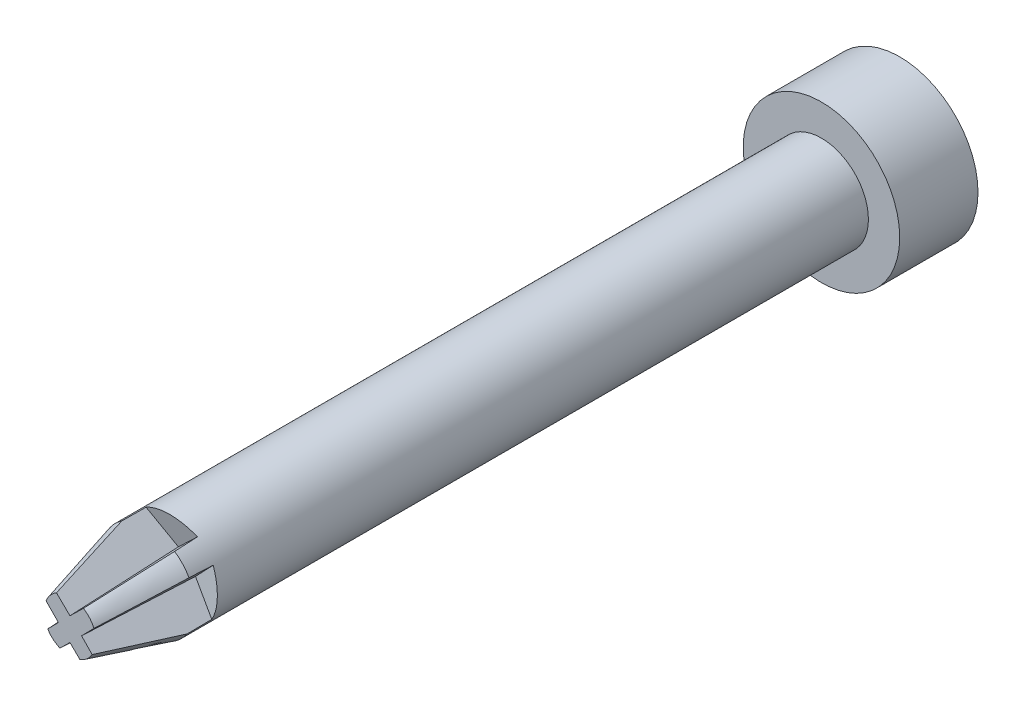
ISO-10303-21;
HEADER;
FILE_DESCRIPTION(('STEP AP214'),'2;1');
FILE_NAME('part.step','',(''),(''),'','','');
FILE_SCHEMA(('AUTOMOTIVE_DESIGN { 1 0 10303 214 1 1 1 1 }'));
ENDSEC;
DATA;
#1=APPLICATION_CONTEXT('core data for automotive mechanical design processes');
#2=APPLICATION_PROTOCOL_DEFINITION('international standard','automotive_design',2000,#1);
#3=PRODUCT_CONTEXT('',#1,'mechanical');
#4=PRODUCT('Part','Part','',(#3));
#5=PRODUCT_RELATED_PRODUCT_CATEGORY('part','',(#4));
#6=PRODUCT_DEFINITION_FORMATION('','',#4);
#7=PRODUCT_DEFINITION_CONTEXT('part definition',#1,'design');
#8=PRODUCT_DEFINITION('design','',#6,#7);
#9=PRODUCT_DEFINITION_SHAPE('','',#8);
#10=(LENGTH_UNIT() NAMED_UNIT(*) SI_UNIT(.MILLI.,.METRE.));
#11=(NAMED_UNIT(*) PLANE_ANGLE_UNIT() SI_UNIT($,.RADIAN.));
#12=(NAMED_UNIT(*) SI_UNIT($,.STERADIAN.) SOLID_ANGLE_UNIT());
#13=UNCERTAINTY_MEASURE_WITH_UNIT(LENGTH_MEASURE(1.E-05),#10,'distance_accuracy_value','');
#14=(GEOMETRIC_REPRESENTATION_CONTEXT(3) GLOBAL_UNCERTAINTY_ASSIGNED_CONTEXT((#13)) GLOBAL_UNIT_ASSIGNED_CONTEXT((#10,
#11,#12)) REPRESENTATION_CONTEXT('',''));
#15=CARTESIAN_POINT('',(0.,0.,0.));
#16=DIRECTION('',(0.,0.,1.));
#17=DIRECTION('',(1.,0.,0.));
#18=AXIS2_PLACEMENT_3D('',#15,#16,#17);
#19=CARTESIAN_POINT('',(0.,0.,197.));
#20=DIRECTION('',(0.,0.,1.));
#21=DIRECTION('',(1.,0.,0.));
#22=AXIS2_PLACEMENT_3D('',#19,#20,#21);
#23=PLANE('',#22);
#24=DIRECTION('',(0.699586163928732,-0.714548248363595,0.));
#25=VECTOR('',#24,1.);
#26=CARTESIAN_POINT('',(0.29599328076598,0.289795411735981,197.));
#27=LINE('',#26,#25);
#28=CARTESIAN_POINT('',(0.739944249786152,-0.163650358962539,197.));
#29=VERTEX_POINT('',#28);
#30=CARTESIAN_POINT('',(1.42075076118684,-0.859017313425996,197.));
#31=VERTEX_POINT('',#30);
#32=EDGE_CURVE('E1051',#29,#31,#27,.T.);
#33=ORIENTED_EDGE('',*,*,#32,.F.);
#34=DIRECTION('',(-0.699586163928716,-0.71454824836361,0.));
#35=VECTOR('',#34,1.);
#36=CARTESIAN_POINT('',(0.459607004309381,-0.449983191192362,197.));
#37=LINE('',#36,#35);
#38=CARTESIAN_POINT('',(1.530389847873,0.643700538842291,197.));
#39=VERTEX_POINT('',#38);
#40=EDGE_CURVE('E706',#39,#29,#37,.T.);
#41=ORIENTED_EDGE('',*,*,#40,.F.);
#42=CARTESIAN_POINT('',(0.,0.,197.));
#43=DIRECTION('',(0.,0.,1.));
#44=DIRECTION('',(1.,0.,0.));
#45=AXIS2_PLACEMENT_3D('',#42,#43,#44);
#46=CIRCLE('',#45,1.66025403784439);
#47=CARTESIAN_POINT('',(0.861179654206774,1.41944111302967,197.));
#48=VERTEX_POINT('',#47);
#49=EDGE_CURVE('E1040',#39,#48,#46,.T.);
#50=ORIENTED_EDGE('',*,*,#49,.T.);
#51=DIRECTION('',(0.714548248363603,0.699586163928724,0.));
#52=VECTOR('',#51,1.);
#53=CARTESIAN_POINT('',(-0.288082439692476,0.294243673303328,197.));
#54=LINE('',#53,#52);
#55=CARTESIAN_POINT('',(0.,0.576293890823606,197.));
#56=VERTEX_POINT('',#55);
#57=EDGE_CURVE('E1083',#56,#48,#54,.T.);
#58=ORIENTED_EDGE('',*,*,#57,.F.);
#59=DIRECTION('',(0.714548248363602,-0.699586163928724,0.));
#60=VECTOR('',#59,1.);
#61=CARTESIAN_POINT('',(0.288082439692476,0.294243673303328,197.));
#62=LINE('',#61,#60);
#63=CARTESIAN_POINT('',(-0.861179654206774,1.41944111302967,197.));
#64=VERTEX_POINT('',#63);
#65=EDGE_CURVE('E1089',#64,#56,#62,.T.);
#66=ORIENTED_EDGE('',*,*,#65,.F.);
#67=CARTESIAN_POINT('',(-1.53038984787301,0.643700538842268,197.));
#68=VERTEX_POINT('',#67);
#69=EDGE_CURVE('E1033',#64,#68,#46,.T.);
#70=ORIENTED_EDGE('',*,*,#69,.T.);
#71=DIRECTION('',(-0.699586163928727,0.7145482483636,0.));
#72=VECTOR('',#71,1.);
#73=CARTESIAN_POINT('',(-0.459607004309376,-0.449983191192369,197.));
#74=LINE('',#73,#72);
#75=CARTESIAN_POINT('',(-0.739944249786153,-0.163650358962549,197.));
#76=VERTEX_POINT('',#75);
#77=EDGE_CURVE('E1112',#76,#68,#74,.T.);
#78=ORIENTED_EDGE('',*,*,#77,.F.);
#79=DIRECTION('',(0.699586163928721,0.714548248363605,0.));
#80=VECTOR('',#79,1.);
#81=CARTESIAN_POINT('',(-0.295993280765985,0.289795411735978,197.));
#82=LINE('',#81,#80);
#83=CARTESIAN_POINT('',(-1.42075076118683,-0.859017313426014,197.));
#84=VERTEX_POINT('',#83);
#85=EDGE_CURVE('E1078',#84,#76,#82,.T.);
#86=ORIENTED_EDGE('',*,*,#85,.F.);
#87=CARTESIAN_POINT('',(-0.641250668282917,-1.53141798690146,197.));
#88=VERTEX_POINT('',#87);
#89=EDGE_CURVE('E1039',#84,#88,#46,.T.);
#90=ORIENTED_EDGE('',*,*,#89,.T.);
#91=DIRECTION('',(-0.714548248363603,-0.699586163928724,0.));
#92=VECTOR('',#91,1.);
#93=CARTESIAN_POINT('',(0.45169616323587,-0.461356611772033,197.));
#94=LINE('',#93,#92);
#95=CARTESIAN_POINT('',(0.,-0.903594608748699,197.));
#96=VERTEX_POINT('',#95);
#97=EDGE_CURVE('E1013',#96,#88,#94,.T.);
#98=ORIENTED_EDGE('',*,*,#97,.F.);
#99=DIRECTION('',(-0.714548248363602,0.699586163928724,0.));
#100=VECTOR('',#99,1.);
#101=CARTESIAN_POINT('',(-0.45169616323587,-0.461356611772034,197.));
#102=LINE('',#101,#100);
#103=CARTESIAN_POINT('',(0.641250668282917,-1.53141798690146,197.));
#104=VERTEX_POINT('',#103);
#105=EDGE_CURVE('E1014',#104,#96,#102,.T.);
#106=ORIENTED_EDGE('',*,*,#105,.F.);
#107=EDGE_CURVE('E1062',#104,#31,#46,.T.);
#108=ORIENTED_EDGE('',*,*,#107,.T.);
#109=EDGE_LOOP('',(#33,#41,#50,#58,#66,#70,#78,#86,#90,#98,#106,#108));
#110=FACE_BOUND('',#109,.T.);
#111=ADVANCED_FACE('F584',(#110),#23,.T.);
#112=CARTESIAN_POINT('',(3.50622818997328,2.33634964103749,190.721482129121));
#113=DIRECTION('',(-0.714078893728453,0.699126637214484,-0.0362391869212804));
#114=DIRECTION('',(-0.683012701892212,-0.707106781186554,-0.183012701892219));
#115=AXIS2_PLACEMENT_3D('',#112,#113,#114);
#116=PLANE('',#115);
#117=CARTESIAN_POINT('',(2.60714163459277,1.48429580578662,191.9998));
#118=CARTESIAN_POINT('',(2.51806131634228,1.41492312781182,192.416754389044));
#119=CARTESIAN_POINT('',(2.4289099380065,1.34547645141084,192.833681410924));
#120=CARTESIAN_POINT('',(2.25034696882207,1.20631203283299,193.667433436914));
#121=CARTESIAN_POINT('',(2.16093537856481,1.13659429127206,194.084258441253));
#122=CARTESIAN_POINT('',(1.98173332971551,0.996764234670463,194.917761786911));
#123=CARTESIAN_POINT('',(1.89194287044739,0.926651918925634,195.334440127966));
#124=CARTESIAN_POINT('',(1.75678597891456,0.820992610790427,195.959273318836));
#125=CARTESIAN_POINT('',(1.71165509669266,0.78569099548431,196.167520564261));
#126=CARTESIAN_POINT('',(1.62117733445753,0.714862739352697,196.583930012619));
#127=CARTESIAN_POINT('',(1.57583045426333,0.67933609833866,196.79209221548));
#128=CARTESIAN_POINT('',(1.53034613108613,0.64366625407019,197.0002));
#129=B_SPLINE_CURVE_WITH_KNOTS('',3,(#117,#118,#119,#120,#121,#122,#123,#124,#125,#126,#127,
#128),.UNSPECIFIED.,.F.,.F.,(4,2,2,2,2,4),(0.,1.29591277430789,2.59182260562914,
3.88773475041023,4.53569228742606,5.18365036741589),.UNSPECIFIED.);
#130=CARTESIAN_POINT('',(2.60709891028716,1.48426253472204,192.));
#131=VERTEX_POINT('',#130);
#132=EDGE_CURVE('E757',#131,#39,#129,.T.);
#133=ORIENTED_EDGE('',*,*,#132,.T.);
#134=ORIENTED_EDGE('',*,*,#40,.T.);
#135=DIRECTION('',(0.0506843289464869,0.,-0.998714723431694));
#136=VECTOR('',#135,1.);
#137=CARTESIAN_POINT('',(0.909991336108624,-0.163650358962537,193.649289192203));
#138=LINE('',#137,#136);
#139=CARTESIAN_POINT('',(1.09141362425063,-0.163650358962536,190.074434516365));
#140=VERTEX_POINT('',#139);
#141=EDGE_CURVE('E700',#29,#140,#138,.T.);
#142=ORIENTED_EDGE('',*,*,#141,.T.);
#143=DIRECTION('',(-0.683012701892212,-0.707106781186554,-0.183012701892219));
#144=VECTOR('',#143,1.);
#145=CARTESIAN_POINT('',(3.50622818997328,2.33634964103749,190.721482129121));
#146=LINE('',#145,#144);
#147=CARTESIAN_POINT('',(2.63491583543772,1.43430071468977,190.488014687368));
#148=VERTEX_POINT('',#147);
#149=EDGE_CURVE('E703',#148,#140,#146,.T.);
#150=ORIENTED_EDGE('',*,*,#149,.F.);
#151=CARTESIAN_POINT('',(0.,0.,214.737453598082));
#152=DIRECTION('',(-0.714078893728453,0.699126637214484,-0.0362391869212804));
#153=DIRECTION('',(0.0258946475367224,-0.0253524337621543,-0.999343144936355));
#154=AXIS2_PLACEMENT_3D('',#151,#152,#153);
#155=ELLIPSE('',#154,82.7833142756946,3.);
#156=EDGE_CURVE('E601',#131,#148,#155,.T.);
#157=ORIENTED_EDGE('',*,*,#156,.F.);
#158=EDGE_LOOP('',(#133,#134,#142,#150,#157));
#159=FACE_BOUND('',#158,.T.);
#160=ADVANCED_FACE('F702',(#159),#116,.F.);
#161=CARTESIAN_POINT('',(0.,0.,197.));
#162=DIRECTION('',(0.,0.,-1.));
#163=DIRECTION('',(-1.,0.,0.));
#164=AXIS2_PLACEMENT_3D('',#161,#162,#163);
#165=CONICAL_SURFACE('',#164,1.66025403784439,0.261799387799146);
#166=ORIENTED_EDGE('',*,*,#132,.F.);
#167=CARTESIAN_POINT('',(0.,0.,192.));
#168=DIRECTION('',(0.,0.,1.));
#169=DIRECTION('',(1.,0.,0.));
#170=AXIS2_PLACEMENT_3D('',#167,#168,#169);
#171=CIRCLE('',#170,3.);
#172=CARTESIAN_POINT('',(1.68640608862164,2.48113572870568,192.));
#173=VERTEX_POINT('',#172);
#174=EDGE_CURVE('E839',#173,#131,#171,.F.);
#175=ORIENTED_EDGE('',*,*,#174,.F.);
#176=CARTESIAN_POINT('',(0.86114652718893,1.41939852975458,197.0002));
#177=CARTESIAN_POINT('',(0.931441216917767,1.50976194257552,196.575750195153));
#178=CARTESIAN_POINT('',(1.00164456563886,1.60003764034809,196.151266629425));
#179=CARTESIAN_POINT('',(1.14192364722468,1.78046648248309,195.302252398651));
#180=CARTESIAN_POINT('',(1.21199938009957,1.87061962685531,194.877721733609));
#181=CARTESIAN_POINT('',(1.34949348406812,2.04753041521278,194.044301558918));
#182=CARTESIAN_POINT('',(1.41691448281397,2.1342905826629,193.635413018073));
#183=CARTESIAN_POINT('',(1.5517082099811,2.30776456244076,192.817618114373));
#184=CARTESIAN_POINT('',(1.61908093839886,2.39447837476512,192.408711751516));
#185=CARTESIAN_POINT('',(1.68643903316736,2.48117813332948,191.9998));
#186=B_SPLINE_CURVE_WITH_KNOTS('',3,(#176,#177,#178,#179,#180,#181,#182,#183,#184,#185),
.UNSPECIFIED.,.F.,.F.,(4,2,2,2,4),(0.,1.31885577033416,2.6377114354524,3.90789441444805,
5.17807748617779),.UNSPECIFIED.);
#187=EDGE_CURVE('E838',#48,#173,#186,.T.);
#188=ORIENTED_EDGE('',*,*,#187,.F.);
#189=ORIENTED_EDGE('',*,*,#49,.F.);
#190=EDGE_LOOP('',(#166,#175,#188,#189));
#191=FACE_BOUND('',#190,.T.);
#192=ADVANCED_FACE('F587',(#191),#165,.T.);
#193=CARTESIAN_POINT('',(0.,0.927763265288087,190.074434516365));
#194=DIRECTION('',(0.699126637214491,-0.714078893728446,-0.0362391869212804));
#195=DIRECTION('',(0.707106781186547,0.68301270189222,0.183012701892219));
#196=AXIS2_PLACEMENT_3D('',#193,#194,#195);
#197=PLANE('',#196);
#198=DIRECTION('',(0.707106781186547,0.68301270189222,0.183012701892219));
#199=VECTOR('',#198,1.);
#200=CARTESIAN_POINT('',(0.,0.927763265288087,190.074434516365));
#201=LINE('',#200,#199);
#202=CARTESIAN_POINT('',(0.,0.927763265288087,190.074434516365));
#203=VERTEX_POINT('',#202);
#204=CARTESIAN_POINT('',(1.64010460440063,2.51198266049427,190.498924823944));
#205=VERTEX_POINT('',#204);
#206=EDGE_CURVE('E851',#203,#205,#201,.T.);
#207=ORIENTED_EDGE('',*,*,#206,.F.);
#208=DIRECTION('',(0.,0.0506843289464869,-0.998714723431694));
#209=VECTOR('',#208,1.);
#210=CARTESIAN_POINT('',(0.,0.746340977146077,193.649289192203));
#211=LINE('',#210,#209);
#212=EDGE_CURVE('E1091',#56,#203,#211,.T.);
#213=ORIENTED_EDGE('',*,*,#212,.F.);
#214=ORIENTED_EDGE('',*,*,#57,.T.);
#215=ORIENTED_EDGE('',*,*,#187,.T.);
#216=CARTESIAN_POINT('',(0.,0.,208.35564395845));
#217=DIRECTION('',(0.699126637214491,-0.714078893728446,-0.0362391869212804));
#218=DIRECTION('',(-0.0253524337621546,0.0258946475367221,-0.999343144936355));
#219=AXIS2_PLACEMENT_3D('',#216,#217,#218);
#220=ELLIPSE('',#219,82.7833142756947,3.);
#221=EDGE_CURVE('E1044',#205,#173,#220,.T.);
#222=ORIENTED_EDGE('',*,*,#221,.F.);
#223=EDGE_LOOP('',(#207,#213,#214,#215,#222));
#224=FACE_BOUND('',#223,.T.);
#225=ADVANCED_FACE('F821',(#224),#197,.F.);
#226=CARTESIAN_POINT('',(-1.23485753587835E-13,-47.4564602746657,177.109920892427));
#227=DIRECTION('',(0.,-0.25881904510252,0.965925826289069));
#228=DIRECTION('',(0.,-0.965925826289069,-0.25881904510252));
#229=AXIS2_PLACEMENT_3D('',#226,#227,#228);
#230=PLANE('',#229);
#231=CARTESIAN_POINT('',(0.,0.,189.825841098664));
#232=DIRECTION('',(0.,-0.25881904510252,0.965925826289069));
#233=DIRECTION('',(0.,-0.965925826289069,-0.25881904510252));
#234=AXIS2_PLACEMENT_3D('',#231,#232,#233);
#235=ELLIPSE('',#234,3.10582854123025,3.);
#236=CARTESIAN_POINT('',(-1.64010460440062,2.51198266049426,190.498924823944));
#237=VERTEX_POINT('',#236);
#238=EDGE_CURVE('E846',#205,#237,#235,.T.);
#239=ORIENTED_EDGE('',*,*,#238,.T.);
#240=DIRECTION('',(0.707106781186547,-0.68301270189222,-0.183012701892219));
#241=VECTOR('',#240,1.);
#242=CARTESIAN_POINT('',(-2.5,3.34257783101076,190.721482129121));
#243=LINE('',#242,#241);
#244=EDGE_CURVE('E855',#237,#203,#243,.T.);
#245=ORIENTED_EDGE('',*,*,#244,.T.);
#246=ORIENTED_EDGE('',*,*,#206,.T.);
#247=EDGE_LOOP('',(#239,#245,#246));
#248=FACE_BOUND('',#247,.T.);
#249=ADVANCED_FACE('F819',(#248),#230,.T.);
#250=CARTESIAN_POINT('',(-2.5,3.34257783101076,190.721482129121));
#251=DIRECTION('',(-0.699126637214491,-0.714078893728446,-0.0362391869212804));
#252=DIRECTION('',(0.707106781186547,-0.68301270189222,-0.183012701892219));
#253=AXIS2_PLACEMENT_3D('',#250,#251,#252);
#254=PLANE('',#253);
#255=CARTESIAN_POINT('',(-1.68643903316736,2.48117813332948,191.9998));
#256=CARTESIAN_POINT('',(-1.61779022937567,2.39281709144734,192.416546317323));
#257=CARTESIAN_POINT('',(-1.54912644969211,2.30444166709694,192.833287120507));
#258=CARTESIAN_POINT('',(-1.41174835610611,2.1276422892228,193.666750068617));
#259=CARTESIAN_POINT('',(-1.34303404220746,2.03921833570272,194.083472213544));
#260=CARTESIAN_POINT('',(-1.20553428340741,1.8623021167834,194.916890302268));
#261=CARTESIAN_POINT('',(-1.13674883850184,1.77380985138016,195.333586246063));
#262=CARTESIAN_POINT('',(-0.999053923542291,1.59670621548949,196.166932358394));
#263=CARTESIAN_POINT('',(-0.930144453478501,1.50809484499265,196.583582526926));
#264=CARTESIAN_POINT('',(-0.861146527188932,1.41939852975458,197.0002));
#265=B_SPLINE_CURVE_WITH_KNOTS('',3,(#255,#256,#257,#258,#259,#260,#261,#262,#263,#264),
.UNSPECIFIED.,.F.,.F.,(4,2,2,2,4),(0.,1.29451938134786,2.58903866525549,3.8835580248644,
5.17807748682326),.UNSPECIFIED.);
#266=CARTESIAN_POINT('',(-1.68640608862164,2.48113572870568,192.));
#267=VERTEX_POINT('',#266);
#268=EDGE_CURVE('E831',#267,#64,#265,.T.);
#269=ORIENTED_EDGE('',*,*,#268,.T.);
#270=ORIENTED_EDGE('',*,*,#65,.T.);
#271=ORIENTED_EDGE('',*,*,#212,.T.);
#272=ORIENTED_EDGE('',*,*,#244,.F.);
#273=CARTESIAN_POINT('',(0.,0.,208.35564395845));
#274=DIRECTION('',(-0.699126637214491,-0.714078893728446,-0.0362391869212804));
#275=DIRECTION('',(0.0253524337621546,0.0258946475367221,-0.999343144936355));
#276=AXIS2_PLACEMENT_3D('',#273,#274,#275);
#277=ELLIPSE('',#276,82.7833142756946,3.);
#278=EDGE_CURVE('E1085',#267,#237,#277,.T.);
#279=ORIENTED_EDGE('',*,*,#278,.F.);
#280=EDGE_LOOP('',(#269,#270,#271,#272,#279));
#281=FACE_BOUND('',#280,.T.);
#282=ADVANCED_FACE('F814',(#281),#254,.F.);
#283=CARTESIAN_POINT('',(-1.53034613108613,0.643666254070164,197.0002));
#284=CARTESIAN_POINT('',(-1.57663569662924,0.679967536933393,196.788406949672));
#285=CARTESIAN_POINT('',(-1.62278317102792,0.716120773809231,196.576557645155));
#286=CARTESIAN_POINT('',(-1.71485551337905,0.788195337755538,196.152771402877));
#287=CARTESIAN_POINT('',(-1.76078038152309,0.824116665025623,195.940834465191));
#288=CARTESIAN_POINT('',(-1.89831335062945,0.931628985696406,195.304929932592));
#289=CARTESIAN_POINT('',(-1.98968002638153,1.00296848259012,194.880867653982));
#290=CARTESIAN_POINT('',(-2.16885435470994,1.14276966552658,194.04735349932));
#291=CARTESIAN_POINT('',(-2.25667520830555,1.21124510120581,193.637906760466));
#292=CARTESIAN_POINT('',(-2.43206776236127,1.34793642799956,192.818915611601));
#293=CARTESIAN_POINT('',(-2.51963946227143,1.4161523185413,192.409371201375));
#294=CARTESIAN_POINT('',(-2.60714163459279,1.48429580578658,191.9998));
#295=B_SPLINE_CURVE_WITH_KNOTS('',3,(#283,#284,#285,#286,#287,#288,#289,#290,#291,#292,#293,
#294),.UNSPECIFIED.,.F.,.F.,(4,2,2,2,2,4),(0.,0.659432155156403,1.31886374262501,
2.63772391630735,3.91068573626867,5.18365036381932),.UNSPECIFIED.);
#296=CARTESIAN_POINT('',(-2.60709891028719,1.484262534722,192.));
#297=VERTEX_POINT('',#296);
#298=EDGE_CURVE('E904',#68,#297,#295,.T.);
#299=ORIENTED_EDGE('',*,*,#298,.F.);
#300=ORIENTED_EDGE('',*,*,#69,.F.);
#301=ORIENTED_EDGE('',*,*,#268,.F.);
#302=EDGE_CURVE('E1032',#297,#267,#171,.F.);
#303=ORIENTED_EDGE('',*,*,#302,.F.);
#304=EDGE_LOOP('',(#299,#300,#301,#303));
#305=FACE_BOUND('',#304,.T.);
#306=ADVANCED_FACE('F818',(#305),#165,.T.);
#307=CARTESIAN_POINT('',(-1.09141362425063,-0.16365035896255,190.074434516365));
#308=DIRECTION('',(0.714078893728444,0.699126637214494,-0.0362391869212804));
#309=DIRECTION('',(-0.683012701892222,0.707106781186545,0.183012701892219));
#310=AXIS2_PLACEMENT_3D('',#307,#308,#309);
#311=PLANE('',#310);
#312=DIRECTION('',(-0.683012701892222,0.707106781186545,0.183012701892219));
#313=VECTOR('',#312,1.);
#314=CARTESIAN_POINT('',(-1.09141362425063,-0.16365035896255,190.074434516365));
#315=LINE('',#314,#313);
#316=CARTESIAN_POINT('',(-1.09141362425063,-0.16365035896255,190.074434516365));
#317=VERTEX_POINT('',#316);
#318=CARTESIAN_POINT('',(-2.63491583543774,1.43430071468974,190.488014687368));
#319=VERTEX_POINT('',#318);
#320=EDGE_CURVE('E915',#317,#319,#315,.T.);
#321=ORIENTED_EDGE('',*,*,#320,.F.);
#322=DIRECTION('',(-0.0506843289464869,0.,-0.998714723431694));
#323=VECTOR('',#322,1.);
#324=CARTESIAN_POINT('',(-0.909991336108624,-0.16365035896255,193.649289192203));
#325=LINE('',#324,#323);
#326=EDGE_CURVE('E1122',#76,#317,#325,.T.);
#327=ORIENTED_EDGE('',*,*,#326,.F.);
#328=ORIENTED_EDGE('',*,*,#77,.T.);
#329=ORIENTED_EDGE('',*,*,#298,.T.);
#330=CARTESIAN_POINT('',(0.,0.,214.737453598083));
#331=DIRECTION('',(0.714078893728444,0.699126637214494,-0.0362391869212804));
#332=DIRECTION('',(-0.025894647536722,-0.0253524337621547,-0.999343144936355));
#333=AXIS2_PLACEMENT_3D('',#330,#331,#332);
#334=ELLIPSE('',#333,82.7833142756947,3.);
#335=EDGE_CURVE('E856',#319,#297,#334,.T.);
#336=ORIENTED_EDGE('',*,*,#335,.F.);
#337=EDGE_LOOP('',(#321,#327,#328,#329,#336));
#338=FACE_BOUND('',#337,.T.);
#339=ADVANCED_FACE('F890',(#338),#311,.F.);
#340=CARTESIAN_POINT('',(47.2928099157032,-0.163650358962505,177.109920892427));
#341=DIRECTION('',(0.25881904510252,0.,0.965925826289069));
#342=DIRECTION('',(0.965925826289069,0.,-0.25881904510252));
#343=AXIS2_PLACEMENT_3D('',#340,#341,#342);
#344=PLANE('',#343);
#345=CARTESIAN_POINT('',(0.,0.,189.781991117138));
#346=DIRECTION('',(0.25881904510252,0.,0.965925826289069));
#347=DIRECTION('',(0.965925826289069,0.,-0.25881904510252));
#348=AXIS2_PLACEMENT_3D('',#345,#346,#347);
#349=ELLIPSE('',#348,3.10582854123025,3.);
#350=CARTESIAN_POINT('',(-2.51422967221368,-1.63665792252391,190.455676927395));
#351=VERTEX_POINT('',#350);
#352=EDGE_CURVE('E910',#319,#351,#349,.T.);
#353=ORIENTED_EDGE('',*,*,#352,.T.);
#354=DIRECTION('',(0.683012701892217,0.70710678118655,-0.183012701892219));
#355=VECTOR('',#354,1.);
#356=CARTESIAN_POINT('',(-3.5062281899733,-2.66365035896256,190.721482129121));
#357=LINE('',#356,#355);
#358=EDGE_CURVE('E919',#351,#317,#357,.T.);
#359=ORIENTED_EDGE('',*,*,#358,.T.);
#360=ORIENTED_EDGE('',*,*,#320,.T.);
#361=EDGE_LOOP('',(#353,#359,#360));
#362=FACE_BOUND('',#361,.T.);
#363=ADVANCED_FACE('F888',(#362),#344,.T.);
#364=CARTESIAN_POINT('',(-3.5062281899733,-2.66365035896256,190.721482129121));
#365=DIRECTION('',(0.714078893728449,-0.699126637214489,-0.0362391869212804));
#366=DIRECTION('',(0.683012701892217,0.70710678118655,-0.183012701892219));
#367=AXIS2_PLACEMENT_3D('',#364,#365,#366);
#368=PLANE('',#367);
#369=CARTESIAN_POINT('',(-2.48258152432362,-1.68437244010635,191.9998));
#370=CARTESIAN_POINT('',(-2.39421593322193,-1.61571905499919,192.416547575132));
#371=CARTESIAN_POINT('',(-2.30583557421962,-1.54705029265156,192.833289488098));
#372=CARTESIAN_POINT('',(-2.12902501896466,-1.40966087149513,193.666754150527));
#373=CARTESIAN_POINT('',(-2.04059482271598,-1.34094021269047,194.083476899991));
#374=CARTESIAN_POINT('',(-1.86366427203259,-1.20342584150024,194.916895488147));
#375=CARTESIAN_POINT('',(-1.77516391759355,-1.13463212911017,195.333591326838));
#376=CARTESIAN_POINT('',(-1.59804085557875,-0.996917296687283,196.166935975452));
#377=CARTESIAN_POINT('',(-1.50941814799278,-0.927996176643832,196.58358478537));
#378=CARTESIAN_POINT('',(-1.42070817100906,-0.858984179357864,197.0002));
#379=B_SPLINE_CURVE_WITH_KNOTS('',3,(#369,#370,#371,#372,#373,#374,#375,#376,#377,#378),
.UNSPECIFIED.,.F.,.F.,(4,2,2,2,4),(0.,1.2945280071153,2.58905591142892,3.88358389561614,
5.17811198778946),.UNSPECIFIED.);
#380=CARTESIAN_POINT('',(-2.48253911766011,-1.6843394934773,192.));
#381=VERTEX_POINT('',#380);
#382=EDGE_CURVE('E848',#381,#84,#379,.T.);
#383=ORIENTED_EDGE('',*,*,#382,.T.);
#384=ORIENTED_EDGE('',*,*,#85,.T.);
#385=ORIENTED_EDGE('',*,*,#326,.T.);
#386=ORIENTED_EDGE('',*,*,#358,.F.);
#387=CARTESIAN_POINT('',(0.,0.,208.423165952007));
#388=DIRECTION('',(0.714078893728449,-0.699126637214489,-0.0362391869212804));
#389=DIRECTION('',(-0.0258946475367222,0.0253524337621545,-0.999343144936355));
#390=AXIS2_PLACEMENT_3D('',#387,#388,#389);
#391=ELLIPSE('',#390,82.7833142756946,3.);
#392=EDGE_CURVE('E1114',#381,#351,#391,.T.);
#393=ORIENTED_EDGE('',*,*,#392,.F.);
#394=EDGE_LOOP('',(#383,#384,#385,#386,#393));
#395=FACE_BOUND('',#394,.T.);
#396=ADVANCED_FACE('F882',(#395),#368,.F.);
#397=CARTESIAN_POINT('',(-0.641216365269342,-1.53137425225507,197.0002));
#398=CARTESIAN_POINT('',(-0.677535712526489,-1.57768115664,196.788413793038));
#399=CARTESIAN_POINT('',(-0.713705010087951,-1.62384404796833,196.576570546853));
#400=CARTESIAN_POINT('',(-0.78580859388095,-1.71594424862418,196.152795218738));
#401=CARTESIAN_POINT('',(-0.821742880320274,-1.76188155815114,195.940863136886));
#402=CARTESIAN_POINT('',(-0.929290783322183,-1.89944868826515,195.304971929667));
#403=CARTESIAN_POINT('',(-1.00064961257231,-1.99083392605556,194.880916853358));
#404=CARTESIAN_POINT('',(-1.14048605760875,-2.1700428573496,194.047401137568));
#405=CARTESIAN_POINT('',(-1.20897758581871,-2.257879908112,193.637945697138));
#406=CARTESIAN_POINT('',(-1.345697809405,-2.43330170136539,192.818935878523));
#407=CARTESIAN_POINT('',(-1.41392650418614,-2.52088644328491,192.409381500116));
#408=CARTESIAN_POINT('',(-1.48208190784538,-2.60840080515633,191.9998));
#409=B_SPLINE_CURVE_WITH_KNOTS('',3,(#397,#398,#399,#400,#401,#402,#403,#404,#405,#406,#407,
#408),.UNSPECIFIED.,.F.,.F.,(4,2,2,2,2,4),(0.,0.65943227282092,1.31886396251991,
2.63772426236053,3.91072911734781,5.18373685337862),.UNSPECIFIED.);
#410=CARTESIAN_POINT('',(-1.48204863185944,-2.60835807603242,192.));
#411=VERTEX_POINT('',#410);
#412=EDGE_CURVE('E966',#88,#411,#409,.T.);
#413=ORIENTED_EDGE('',*,*,#412,.F.);
#414=ORIENTED_EDGE('',*,*,#89,.F.);
#415=ORIENTED_EDGE('',*,*,#382,.F.);
#416=EDGE_CURVE('E1025',#411,#381,#171,.F.);
#417=ORIENTED_EDGE('',*,*,#416,.F.);
#418=EDGE_LOOP('',(#413,#414,#415,#417));
#419=FACE_BOUND('',#418,.T.);
#420=ADVANCED_FACE('F887',(#419),#165,.T.);
#421=CARTESIAN_POINT('',(0.,-1.25506398321318,190.074434516365));
#422=DIRECTION('',(-0.699126637214491,0.714078893728446,-0.0362391869212804));
#423=DIRECTION('',(-0.707106781186547,-0.68301270189222,0.183012701892219));
#424=AXIS2_PLACEMENT_3D('',#421,#422,#423);
#425=PLANE('',#424);
#426=DIRECTION('',(-0.707106781186547,-0.68301270189222,0.183012701892219));
#427=VECTOR('',#426,1.);
#428=CARTESIAN_POINT('',(0.,-1.25506398321318,190.074434516365));
#429=LINE('',#428,#427);
#430=CARTESIAN_POINT('',(0.,-1.25506398321318,190.074434516365));
#431=VERTEX_POINT('',#430);
#432=CARTESIAN_POINT('',(-1.43060627186015,-2.63692352845402,190.444702665565));
#433=VERTEX_POINT('',#432);
#434=EDGE_CURVE('E976',#431,#433,#429,.T.);
#435=ORIENTED_EDGE('',*,*,#434,.F.);
#436=DIRECTION('',(0.,-0.0506843289464869,-0.998714723431694));
#437=VECTOR('',#436,1.);
#438=CARTESIAN_POINT('',(0.,-1.07364169507117,193.649289192203));
#439=LINE('',#438,#437);
#440=EDGE_CURVE('E1012',#96,#431,#439,.T.);
#441=ORIENTED_EDGE('',*,*,#440,.F.);
#442=ORIENTED_EDGE('',*,*,#97,.T.);
#443=ORIENTED_EDGE('',*,*,#412,.T.);
#444=CARTESIAN_POINT('',(0.,0.,214.80497559164));
#445=DIRECTION('',(-0.699126637214491,0.714078893728446,-0.0362391869212804));
#446=DIRECTION('',(0.0253524337621546,-0.0258946475367221,-0.999343144936355));
#447=AXIS2_PLACEMENT_3D('',#444,#445,#446);
#448=ELLIPSE('',#447,82.7833142756947,3.);
#449=EDGE_CURVE('E920',#433,#411,#448,.T.);
#450=ORIENTED_EDGE('',*,*,#449,.F.);
#451=EDGE_LOOP('',(#435,#441,#442,#443,#450));
#452=FACE_BOUND('',#451,.T.);
#453=ADVANCED_FACE('F953',(#452),#425,.F.);
#454=CARTESIAN_POINT('',(1.23161484889123E-13,47.1291595567406,177.109920892427));
#455=DIRECTION('',(0.,0.25881904510252,0.965925826289069));
#456=DIRECTION('',(0.,0.965925826289069,-0.25881904510252));
#457=AXIS2_PLACEMENT_3D('',#454,#455,#456);
#458=PLANE('',#457);
#459=CARTESIAN_POINT('',(0.,0.,189.738141135613));
#460=DIRECTION('',(0.,0.25881904510252,0.965925826289069));
#461=DIRECTION('',(0.,0.965925826289069,-0.25881904510252));
#462=AXIS2_PLACEMENT_3D('',#459,#460,#461);
#463=ELLIPSE('',#462,3.10582854123025,3.);
#464=CARTESIAN_POINT('',(1.43060627186015,-2.63692352845402,190.444702665565));
#465=VERTEX_POINT('',#464);
#466=EDGE_CURVE('E972',#433,#465,#463,.T.);
#467=ORIENTED_EDGE('',*,*,#466,.T.);
#468=DIRECTION('',(-0.707106781186547,0.68301270189222,-0.183012701892219));
#469=VECTOR('',#468,1.);
#470=CARTESIAN_POINT('',(2.5,-3.66987854893585,190.721482129121));
#471=LINE('',#470,#469);
#472=EDGE_CURVE('E979',#465,#431,#471,.T.);
#473=ORIENTED_EDGE('',*,*,#472,.T.);
#474=ORIENTED_EDGE('',*,*,#434,.T.);
#475=EDGE_LOOP('',(#467,#473,#474));
#476=FACE_BOUND('',#475,.T.);
#477=ADVANCED_FACE('F951',(#476),#458,.T.);
#478=CARTESIAN_POINT('',(2.5,-3.66987854893585,190.721482129121));
#479=DIRECTION('',(0.699126637214491,0.714078893728446,-0.0362391869212804));
#480=DIRECTION('',(-0.707106781186547,0.68301270189222,-0.183012701892219));
#481=AXIS2_PLACEMENT_3D('',#478,#479,#480);
#482=PLANE('',#481);
#483=CARTESIAN_POINT('',(1.48208190784538,-2.60840080515633,191.9998));
#484=CARTESIAN_POINT('',(1.4126982808031,-2.5193095986654,192.416757708046));
#485=CARTESIAN_POINT('',(1.34323975112398,-2.43014646387951,192.83368771262));
#486=CARTESIAN_POINT('',(1.20404820212628,-2.25155669657271,193.667444384807));
#487=CARTESIAN_POINT('',(1.1343151834477,-2.1621300646663,194.084271052657));
#488=CARTESIAN_POINT('',(0.994449521760264,-1.98289308368783,194.917775828596));
#489=CARTESIAN_POINT('',(0.924316878019491,-1.89308273391306,195.33445393641));
#490=CARTESIAN_POINT('',(0.818620638782295,-1.75788982755109,195.959284310225));
#491=CARTESIAN_POINT('',(0.783305638856291,-1.71274590918428,196.16753021157));
#492=CARTESIAN_POINT('',(0.712447596650909,-1.62223918036592,196.583935801898));
#493=CARTESIAN_POINT('',(0.676904554175261,-1.57687636972598,196.792095490806));
#494=CARTESIAN_POINT('',(0.641216365269344,-1.53137425225507,197.0002));
#495=B_SPLINE_CURVE_WITH_KNOTS('',3,(#483,#484,#485,#486,#487,#488,#489,#490,#491,#492,#493,
#494),.UNSPECIFIED.,.F.,.F.,(4,2,2,2,2,4),(0.,1.29593440114194,2.59186578241634,
3.88779953797978,4.53576791864103,5.18373685707054),.UNSPECIFIED.);
#496=CARTESIAN_POINT('',(1.48204863185944,-2.60835807603242,192.));
#497=VERTEX_POINT('',#496);
#498=EDGE_CURVE('E912',#497,#104,#495,.T.);
#499=ORIENTED_EDGE('',*,*,#498,.T.);
#500=ORIENTED_EDGE('',*,*,#105,.T.);
#501=ORIENTED_EDGE('',*,*,#440,.T.);
#502=ORIENTED_EDGE('',*,*,#472,.F.);
#503=CARTESIAN_POINT('',(0.,0.,214.80497559164));
#504=DIRECTION('',(0.699126637214491,0.714078893728446,-0.0362391869212804));
#505=DIRECTION('',(-0.0253524337621546,-0.0258946475367221,-0.999343144936355));
#506=AXIS2_PLACEMENT_3D('',#503,#504,#505);
#507=ELLIPSE('',#506,82.7833142756946,3.);
#508=EDGE_CURVE('E1009',#497,#465,#507,.T.);
#509=ORIENTED_EDGE('',*,*,#508,.F.);
#510=EDGE_LOOP('',(#499,#500,#501,#502,#509));
#511=FACE_BOUND('',#510,.T.);
#512=ADVANCED_FACE('F946',(#511),#482,.F.);
#513=CARTESIAN_POINT('',(1.42070817100907,-0.858984179357845,197.0002));
#514=CARTESIAN_POINT('',(1.51108489122632,-0.929292726605916,196.575755317509));
#515=CARTESIAN_POINT('',(1.60137149722818,-0.999507434232828,196.151275945509));
#516=CARTESIAN_POINT('',(1.78181881540675,-1.13980575495377,195.302268813104));
#517=CARTESIAN_POINT('',(1.87197952759406,-1.20988936805884,194.877741052701));
#518=CARTESIAN_POINT('',(2.04890450268929,-1.34739793339139,194.044320322667));
#519=CARTESIAN_POINT('',(2.13567135632512,-1.41482558331542,193.635428347742));
#520=CARTESIAN_POINT('',(2.30915745831216,-1.54963131091072,192.817626093029));
#521=CARTESIAN_POINT('',(2.3958767066597,-1.61700938857816,192.408715813238));
#522=CARTESIAN_POINT('',(2.48258152432364,-1.68437244010632,191.9998));
#523=B_SPLINE_CURVE_WITH_KNOTS('',3,(#513,#514,#515,#516,#517,#518,#519,#520,#521,#522),
.UNSPECIFIED.,.F.,.F.,(4,2,2,2,4),(0.,1.31885578411624,2.63771145722397,3.9079116732472,
5.17811198710842),.UNSPECIFIED.);
#524=CARTESIAN_POINT('',(2.48253911766014,-1.68433949347726,192.));
#525=VERTEX_POINT('',#524);
#526=EDGE_CURVE('E750',#31,#525,#523,.T.);
#527=ORIENTED_EDGE('',*,*,#526,.F.);
#528=ORIENTED_EDGE('',*,*,#107,.F.);
#529=ORIENTED_EDGE('',*,*,#498,.F.);
#530=EDGE_CURVE('E609',#525,#497,#171,.F.);
#531=ORIENTED_EDGE('',*,*,#530,.F.);
#532=EDGE_LOOP('',(#527,#528,#529,#531));
#533=FACE_BOUND('',#532,.T.);
#534=ADVANCED_FACE('F743',(#533),#165,.T.);
#535=CARTESIAN_POINT('',(1.09141362425063,-0.163650358962536,190.074434516365));
#536=DIRECTION('',(-0.714078893728439,-0.699126637214499,-0.0362391869212804));
#537=DIRECTION('',(0.683012701892227,-0.70710678118654,0.183012701892219));
#538=AXIS2_PLACEMENT_3D('',#535,#536,#537);
#539=PLANE('',#538);
#540=DIRECTION('',(0.683012701892227,-0.70710678118654,0.183012701892219));
#541=VECTOR('',#540,1.);
#542=CARTESIAN_POINT('',(1.09141362425063,-0.163650358962536,190.074434516365));
#543=LINE('',#542,#541);
#544=CARTESIAN_POINT('',(2.5142296722137,-1.63665792252388,190.455676927395));
#545=VERTEX_POINT('',#544);
#546=EDGE_CURVE('E715',#140,#545,#543,.T.);
#547=ORIENTED_EDGE('',*,*,#546,.F.);
#548=ORIENTED_EDGE('',*,*,#141,.F.);
#549=ORIENTED_EDGE('',*,*,#32,.T.);
#550=ORIENTED_EDGE('',*,*,#526,.T.);
#551=CARTESIAN_POINT('',(0.,0.,208.423165952007));
#552=DIRECTION('',(-0.714078893728439,-0.699126637214499,-0.0362391869212804));
#553=DIRECTION('',(0.0258946475367218,0.0253524337621548,-0.999343144936355));
#554=AXIS2_PLACEMENT_3D('',#551,#552,#553);
#555=ELLIPSE('',#554,82.7833142756947,3.);
#556=EDGE_CURVE('E722',#545,#525,#555,.T.);
#557=ORIENTED_EDGE('',*,*,#556,.F.);
#558=EDGE_LOOP('',(#547,#548,#549,#550,#557));
#559=FACE_BOUND('',#558,.T.);
#560=ADVANCED_FACE('F721',(#559),#539,.F.);
#561=CARTESIAN_POINT('',(-47.2928099157032,-0.163650358962919,177.109920892427));
#562=DIRECTION('',(-0.25881904510252,0.,0.965925826289069));
#563=DIRECTION('',(-0.965925826289069,0.,-0.25881904510252));
#564=AXIS2_PLACEMENT_3D('',#561,#562,#563);
#565=PLANE('',#564);
#566=CARTESIAN_POINT('',(0.,0.,189.781991117138));
#567=DIRECTION('',(-0.25881904510252,0.,0.965925826289069));
#568=DIRECTION('',(-0.965925826289069,0.,-0.25881904510252));
#569=AXIS2_PLACEMENT_3D('',#566,#567,#568);
#570=ELLIPSE('',#569,3.10582854123025,3.);
#571=EDGE_CURVE('E594',#545,#148,#570,.T.);
#572=ORIENTED_EDGE('',*,*,#571,.T.);
#573=ORIENTED_EDGE('',*,*,#149,.T.);
#574=ORIENTED_EDGE('',*,*,#546,.T.);
#575=EDGE_LOOP('',(#572,#573,#574));
#576=FACE_BOUND('',#575,.T.);
#577=ADVANCED_FACE('F714',(#576),#565,.T.);
#578=CARTESIAN_POINT('',(0.,0.,197.));
#579=DIRECTION('',(0.,0.,-1.));
#580=DIRECTION('',(-1.,0.,0.));
#581=AXIS2_PLACEMENT_3D('',#578,#579,#580);
#582=CYLINDRICAL_SURFACE('',#581,3.);
#583=CARTESIAN_POINT('',(0.,0.,149.));
#584=DIRECTION('',(0.,0.,1.));
#585=DIRECTION('',(1.,0.,0.));
#586=AXIS2_PLACEMENT_3D('',#583,#584,#585);
#587=CIRCLE('',#586,3.);
#588=CARTESIAN_POINT('',(3.,0.,149.));
#589=VERTEX_POINT('',#588);
#590=EDGE_CURVE('E723',#589,#589,#587,.T.);
#591=ORIENTED_EDGE('',*,*,#590,.T.);
#592=EDGE_LOOP('',(#591));
#593=FACE_BOUND('',#592,.T.);
#594=ORIENTED_EDGE('',*,*,#571,.F.);
#595=ORIENTED_EDGE('',*,*,#556,.T.);
#596=ORIENTED_EDGE('',*,*,#530,.T.);
#597=ORIENTED_EDGE('',*,*,#508,.T.);
#598=ORIENTED_EDGE('',*,*,#466,.F.);
#599=ORIENTED_EDGE('',*,*,#449,.T.);
#600=ORIENTED_EDGE('',*,*,#416,.T.);
#601=ORIENTED_EDGE('',*,*,#392,.T.);
#602=ORIENTED_EDGE('',*,*,#352,.F.);
#603=ORIENTED_EDGE('',*,*,#335,.T.);
#604=ORIENTED_EDGE('',*,*,#302,.T.);
#605=ORIENTED_EDGE('',*,*,#278,.T.);
#606=ORIENTED_EDGE('',*,*,#238,.F.);
#607=ORIENTED_EDGE('',*,*,#221,.T.);
#608=ORIENTED_EDGE('',*,*,#174,.T.);
#609=ORIENTED_EDGE('',*,*,#156,.T.);
#610=EDGE_LOOP('',(#594,#595,#596,#597,#598,#599,#600,#601,#602,#603,#604,#605,#606,#607,#608,#609));
#611=FACE_BOUND('',#610,.T.);
#612=ADVANCED_FACE('F792',(#593,#611),#582,.T.);
#613=CARTESIAN_POINT('',(0.,0.,149.));
#614=DIRECTION('',(0.,0.,1.));
#615=DIRECTION('',(1.,0.,0.));
#616=AXIS2_PLACEMENT_3D('',#613,#614,#615);
#617=PLANE('',#616);
#618=ORIENTED_EDGE('',*,*,#590,.F.);
#619=EDGE_LOOP('',(#618));
#620=FACE_BOUND('',#619,.T.);
#621=CARTESIAN_POINT('',(0.,0.,149.));
#622=DIRECTION('',(0.,0.,1.));
#623=DIRECTION('',(1.,0.,0.));
#624=AXIS2_PLACEMENT_3D('',#621,#622,#623);
#625=CIRCLE('',#624,5.);
#626=CARTESIAN_POINT('',(5.,0.,149.));
#627=VERTEX_POINT('',#626);
#628=EDGE_CURVE('E780',#627,#627,#625,.T.);
#629=ORIENTED_EDGE('',*,*,#628,.T.);
#630=EDGE_LOOP('',(#629));
#631=FACE_BOUND('',#630,.T.);
#632=ADVANCED_FACE('F794',(#620,#631),#617,.T.);
#633=CARTESIAN_POINT('',(0.,0.,-38.0000000000001));
#634=DIRECTION('',(0.,0.,1.));
#635=DIRECTION('',(1.,0.,0.));
#636=AXIS2_PLACEMENT_3D('',#633,#634,#635);
#637=CYLINDRICAL_SURFACE('',#636,5.);
#638=CARTESIAN_POINT('',(0.,0.,144.));
#639=DIRECTION('',(0.,0.,1.));
#640=DIRECTION('',(1.,0.,0.));
#641=AXIS2_PLACEMENT_3D('',#638,#639,#640);
#642=CIRCLE('',#641,5.);
#643=CARTESIAN_POINT('',(5.,0.,144.));
#644=VERTEX_POINT('',#643);
#645=EDGE_CURVE('E13',#644,#644,#642,.F.);
#646=ORIENTED_EDGE('',*,*,#645,.F.);
#647=EDGE_LOOP('',(#646));
#648=FACE_BOUND('',#647,.T.);
#649=ORIENTED_EDGE('',*,*,#628,.F.);
#650=EDGE_LOOP('',(#649));
#651=FACE_BOUND('',#650,.T.);
#652=ADVANCED_FACE('F796',(#648,#651),#637,.T.);
#653=CARTESIAN_POINT('',(50.0000000000001,0.,144.));
#654=DIRECTION('',(0.,0.,1.));
#655=DIRECTION('',(1.,0.,0.));
#656=AXIS2_PLACEMENT_3D('',#653,#654,#655);
#657=PLANE('',#656);
#658=ORIENTED_EDGE('',*,*,#645,.T.);
#659=EDGE_LOOP('',(#658));
#660=FACE_BOUND('',#659,.T.);
#661=ADVANCED_FACE('F802',(#660),#657,.F.);
#662=CLOSED_SHELL('',(#111,#160,#192,#225,#249,#282,#306,#339,#363,#396,#420,#453,#477,#512,
#534,#560,#577,#612,#632,#652,#661));
#663=MANIFOLD_SOLID_BREP('B2',#662);
#664=ADVANCED_BREP_SHAPE_REPRESENTATION('',(#18,#663),#14);
#665=SHAPE_DEFINITION_REPRESENTATION(#9,#664);
ENDSEC;
END-ISO-10303-21;
